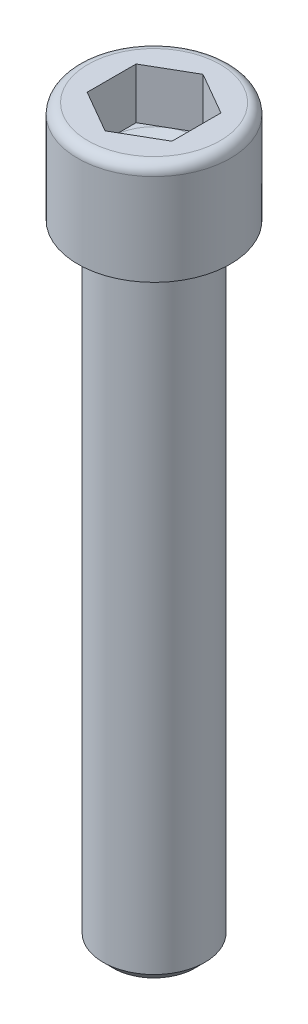
ISO-10303-21;
HEADER;
FILE_DESCRIPTION(('STEP AP214'),'2;1');
FILE_NAME('part.step','',(''),(''),'','','');
FILE_SCHEMA(('AUTOMOTIVE_DESIGN { 1 0 10303 214 1 1 1 1 }'));
ENDSEC;
DATA;
#1=APPLICATION_CONTEXT('core data for automotive mechanical design processes');
#2=APPLICATION_PROTOCOL_DEFINITION('international standard','automotive_design',2000,#1);
#3=PRODUCT_CONTEXT('',#1,'mechanical');
#4=PRODUCT('Part','Part','',(#3));
#5=PRODUCT_RELATED_PRODUCT_CATEGORY('part','',(#4));
#6=PRODUCT_DEFINITION_FORMATION('','',#4);
#7=PRODUCT_DEFINITION_CONTEXT('part definition',#1,'design');
#8=PRODUCT_DEFINITION('design','',#6,#7);
#9=PRODUCT_DEFINITION_SHAPE('','',#8);
#10=(LENGTH_UNIT() NAMED_UNIT(*) SI_UNIT(.MILLI.,.METRE.));
#11=(NAMED_UNIT(*) PLANE_ANGLE_UNIT() SI_UNIT($,.RADIAN.));
#12=(NAMED_UNIT(*) SI_UNIT($,.STERADIAN.) SOLID_ANGLE_UNIT());
#13=UNCERTAINTY_MEASURE_WITH_UNIT(LENGTH_MEASURE(1.E-05),#10,'distance_accuracy_value','');
#14=(GEOMETRIC_REPRESENTATION_CONTEXT(3) GLOBAL_UNCERTAINTY_ASSIGNED_CONTEXT((#13)) GLOBAL_UNIT_ASSIGNED_CONTEXT((#10,
#11,#12)) REPRESENTATION_CONTEXT('',''));
#15=CARTESIAN_POINT('',(0.,0.,0.));
#16=DIRECTION('',(0.,0.,1.));
#17=DIRECTION('',(1.,0.,0.));
#18=AXIS2_PLACEMENT_3D('',#15,#16,#17);
#19=CARTESIAN_POINT('',(0.,85.,5.));
#20=DIRECTION('',(0.,-1.,0.));
#21=DIRECTION('',(0.,0.,-1.));
#22=AXIS2_PLACEMENT_3D('',#19,#20,#21);
#23=PLANE('',#22);
#24=CARTESIAN_POINT('',(0.,85.,0.));
#25=DIRECTION('',(0.,-1.,0.));
#26=DIRECTION('',(0.,0.,-1.));
#27=AXIS2_PLACEMENT_3D('',#24,#25,#26);
#28=CIRCLE('',#27,7.8);
#29=CARTESIAN_POINT('',(0.,85.,-7.8));
#30=VERTEX_POINT('',#29);
#31=EDGE_CURVE('E200',#30,#30,#28,.T.);
#32=ORIENTED_EDGE('',*,*,#31,.F.);
#33=EDGE_LOOP('',(#32));
#34=FACE_BOUND('',#33,.T.);
#35=DIRECTION('',(0.866025403784439,0.,-0.5));
#36=VECTOR('',#35,1.);
#37=CARTESIAN_POINT('',(-4.6650635094611,85.,-3.08012701892219));
#38=LINE('',#37,#36);
#39=CARTESIAN_POINT('',(-5.,85.,-2.88675134594813));
#40=VERTEX_POINT('',#39);
#41=CARTESIAN_POINT('',(0.,85.,-5.77350269189626));
#42=VERTEX_POINT('',#41);
#43=EDGE_CURVE('E70',#40,#42,#38,.T.);
#44=ORIENTED_EDGE('',*,*,#43,.T.);
#45=DIRECTION('',(0.866025403784439,0.,0.5));
#46=VECTOR('',#45,1.);
#47=CARTESIAN_POINT('',(4.6650635094611,85.,-3.08012701892219));
#48=LINE('',#47,#46);
#49=CARTESIAN_POINT('',(5.,85.,-2.88675134594813));
#50=VERTEX_POINT('',#49);
#51=EDGE_CURVE('E12',#42,#50,#48,.T.);
#52=ORIENTED_EDGE('',*,*,#51,.T.);
#53=DIRECTION('',(0.,0.,1.));
#54=VECTOR('',#53,1.);
#55=CARTESIAN_POINT('',(5.,85.,5.));
#56=LINE('',#55,#54);
#57=CARTESIAN_POINT('',(5.,85.,2.88675134594813));
#58=VERTEX_POINT('',#57);
#59=EDGE_CURVE('E55',#50,#58,#56,.T.);
#60=ORIENTED_EDGE('',*,*,#59,.T.);
#61=DIRECTION('',(-0.866025403784439,0.,0.5));
#62=VECTOR('',#61,1.);
#63=CARTESIAN_POINT('',(0.334936490538903,85.,5.58012701892219));
#64=LINE('',#63,#62);
#65=CARTESIAN_POINT('',(0.,85.,5.77350269189626));
#66=VERTEX_POINT('',#65);
#67=EDGE_CURVE('E216',#58,#66,#64,.T.);
#68=ORIENTED_EDGE('',*,*,#67,.T.);
#69=DIRECTION('',(-0.866025403784439,0.,-0.5));
#70=VECTOR('',#69,1.);
#71=CARTESIAN_POINT('',(-0.334936490538903,85.,5.58012701892219));
#72=LINE('',#71,#70);
#73=CARTESIAN_POINT('',(-5.,85.,2.88675134594813));
#74=VERTEX_POINT('',#73);
#75=EDGE_CURVE('E213',#66,#74,#72,.T.);
#76=ORIENTED_EDGE('',*,*,#75,.T.);
#77=DIRECTION('',(0.,0.,-1.));
#78=VECTOR('',#77,1.);
#79=CARTESIAN_POINT('',(-5.,85.,5.));
#80=LINE('',#79,#78);
#81=EDGE_CURVE('E210',#74,#40,#80,.T.);
#82=ORIENTED_EDGE('',*,*,#81,.T.);
#83=EDGE_LOOP('',(#44,#52,#60,#68,#76,#82));
#84=FACE_BOUND('',#83,.T.);
#85=ADVANCED_FACE('F45',(#34,#84),#23,.F.);
#86=CARTESIAN_POINT('',(0.,83.8,0.));
#87=DIRECTION('',(0.,-1.,0.));
#88=DIRECTION('',(0.,0.,-1.));
#89=AXIS2_PLACEMENT_3D('',#86,#87,#88);
#90=TOROIDAL_SURFACE('',#89,7.8,1.2);
#91=CARTESIAN_POINT('',(0.,83.8,0.));
#92=DIRECTION('',(0.,-1.,0.));
#93=DIRECTION('',(0.,0.,-1.));
#94=AXIS2_PLACEMENT_3D('',#91,#92,#93);
#95=CIRCLE('',#94,9.);
#96=CARTESIAN_POINT('',(0.,83.8,-9.));
#97=VERTEX_POINT('',#96);
#98=EDGE_CURVE('E196',#97,#97,#95,.T.);
#99=ORIENTED_EDGE('',*,*,#98,.F.);
#100=EDGE_LOOP('',(#99));
#101=FACE_BOUND('',#100,.T.);
#102=ORIENTED_EDGE('',*,*,#31,.T.);
#103=EDGE_LOOP('',(#102));
#104=FACE_BOUND('',#103,.T.);
#105=ADVANCED_FACE('F246',(#101,#104),#90,.T.);
#106=CARTESIAN_POINT('',(0.,0.,0.));
#107=DIRECTION('',(0.,-1.,0.));
#108=DIRECTION('',(0.,0.,-1.));
#109=AXIS2_PLACEMENT_3D('',#106,#107,#108);
#110=CYLINDRICAL_SURFACE('',#109,9.);
#111=CARTESIAN_POINT('',(0.,73.,0.));
#112=DIRECTION('',(0.,-1.,0.));
#113=DIRECTION('',(0.,0.,-1.));
#114=AXIS2_PLACEMENT_3D('',#111,#112,#113);
#115=CIRCLE('',#114,9.);
#116=CARTESIAN_POINT('',(0.,73.,-9.));
#117=VERTEX_POINT('',#116);
#118=EDGE_CURVE('E192',#117,#117,#115,.T.);
#119=ORIENTED_EDGE('',*,*,#118,.F.);
#120=EDGE_LOOP('',(#119));
#121=FACE_BOUND('',#120,.T.);
#122=ORIENTED_EDGE('',*,*,#98,.T.);
#123=EDGE_LOOP('',(#122));
#124=FACE_BOUND('',#123,.T.);
#125=ADVANCED_FACE('F240',(#121,#124),#110,.T.);
#126=CARTESIAN_POINT('',(0.,73.,9.));
#127=DIRECTION('',(0.,1.,0.));
#128=DIRECTION('',(0.,0.,1.));
#129=AXIS2_PLACEMENT_3D('',#126,#127,#128);
#130=PLANE('',#129);
#131=CARTESIAN_POINT('',(0.,73.,0.));
#132=DIRECTION('',(0.,-1.,0.));
#133=DIRECTION('',(0.,0.,-1.));
#134=AXIS2_PLACEMENT_3D('',#131,#132,#133);
#135=CIRCLE('',#134,6.);
#136=CARTESIAN_POINT('',(0.,73.,-6.));
#137=VERTEX_POINT('',#136);
#138=EDGE_CURVE('E188',#137,#137,#135,.T.);
#139=ORIENTED_EDGE('',*,*,#138,.F.);
#140=EDGE_LOOP('',(#139));
#141=FACE_BOUND('',#140,.T.);
#142=ORIENTED_EDGE('',*,*,#118,.T.);
#143=EDGE_LOOP('',(#142));
#144=FACE_BOUND('',#143,.T.);
#145=ADVANCED_FACE('F234',(#141,#144),#130,.F.);
#146=CARTESIAN_POINT('',(0.,0.,0.));
#147=DIRECTION('',(0.,-1.,0.));
#148=DIRECTION('',(0.,0.,-1.));
#149=AXIS2_PLACEMENT_3D('',#146,#147,#148);
#150=CYLINDRICAL_SURFACE('',#149,6.);
#151=CARTESIAN_POINT('',(0.,0.2,0.));
#152=DIRECTION('',(0.,-1.,0.));
#153=DIRECTION('',(0.,0.,-1.));
#154=AXIS2_PLACEMENT_3D('',#151,#152,#153);
#155=CIRCLE('',#154,6.);
#156=CARTESIAN_POINT('',(0.,0.2,-6.));
#157=VERTEX_POINT('',#156);
#158=EDGE_CURVE('E49',#157,#157,#155,.T.);
#159=ORIENTED_EDGE('',*,*,#158,.F.);
#160=EDGE_LOOP('',(#159));
#161=FACE_BOUND('',#160,.T.);
#162=ORIENTED_EDGE('',*,*,#138,.T.);
#163=EDGE_LOOP('',(#162));
#164=FACE_BOUND('',#163,.T.);
#165=ADVANCED_FACE('F231',(#161,#164),#150,.T.);
#166=CARTESIAN_POINT('',(0.,0.2,0.));
#167=DIRECTION('',(0.,1.,0.));
#168=DIRECTION('',(0.,0.,1.));
#169=AXIS2_PLACEMENT_3D('',#166,#167,#168);
#170=CONICAL_SURFACE('',#169,6.,0.785398163397448);
#171=CARTESIAN_POINT('',(0.,-1.,0.));
#172=DIRECTION('',(0.,-1.,0.));
#173=DIRECTION('',(0.,0.,-1.));
#174=AXIS2_PLACEMENT_3D('',#171,#172,#173);
#175=CIRCLE('',#174,4.8);
#176=CARTESIAN_POINT('',(0.,-1.,-4.8));
#177=VERTEX_POINT('',#176);
#178=EDGE_CURVE('E172',#177,#177,#175,.T.);
#179=ORIENTED_EDGE('',*,*,#178,.F.);
#180=EDGE_LOOP('',(#179));
#181=FACE_BOUND('',#180,.T.);
#182=ORIENTED_EDGE('',*,*,#158,.T.);
#183=EDGE_LOOP('',(#182));
#184=FACE_BOUND('',#183,.T.);
#185=ADVANCED_FACE('F47',(#181,#184),#170,.T.);
#186=CARTESIAN_POINT('',(0.,-1.,4.8));
#187=DIRECTION('',(0.,1.,0.));
#188=DIRECTION('',(0.,0.,1.));
#189=AXIS2_PLACEMENT_3D('',#186,#187,#188);
#190=PLANE('',#189);
#191=ORIENTED_EDGE('',*,*,#178,.T.);
#192=EDGE_LOOP('',(#191));
#193=FACE_BOUND('',#192,.T.);
#194=ADVANCED_FACE('F263',(#193),#190,.F.);
#195=CARTESIAN_POINT('',(0.,79.,0.));
#196=DIRECTION('',(0.,1.,0.));
#197=DIRECTION('',(0.,0.,1.));
#198=AXIS2_PLACEMENT_3D('',#195,#196,#197);
#199=PLANE('',#198);
#200=CARTESIAN_POINT('',(0.,79.,0.));
#201=DIRECTION('',(0.,-1.,0.));
#202=DIRECTION('',(0.,0.,-1.));
#203=AXIS2_PLACEMENT_3D('',#200,#201,#202);
#204=CIRCLE('',#203,5.);
#205=CARTESIAN_POINT('',(-2.5,79.,4.3301270189222));
#206=VERTEX_POINT('',#205);
#207=CARTESIAN_POINT('',(-5.,79.,0.));
#208=VERTEX_POINT('',#207);
#209=EDGE_CURVE('E455',#206,#208,#204,.T.);
#210=ORIENTED_EDGE('',*,*,#209,.T.);
#211=DIRECTION('',(0.,0.,1.));
#212=VECTOR('',#211,1.);
#213=CARTESIAN_POINT('',(-5.,79.,-2.88675134594813));
#214=LINE('',#213,#212);
#215=CARTESIAN_POINT('',(-5.,79.,2.88675134594813));
#216=VERTEX_POINT('',#215);
#217=EDGE_CURVE('E148',#208,#216,#214,.T.);
#218=ORIENTED_EDGE('',*,*,#217,.T.);
#219=DIRECTION('',(0.866025403784439,0.,0.5));
#220=VECTOR('',#219,1.);
#221=CARTESIAN_POINT('',(-5.,79.,2.88675134594813));
#222=LINE('',#221,#220);
#223=EDGE_CURVE('E159',#216,#206,#222,.T.);
#224=ORIENTED_EDGE('',*,*,#223,.T.);
#225=EDGE_LOOP('',(#210,#218,#224));
#226=FACE_BOUND('',#225,.T.);
#227=ADVANCED_FACE('F265',(#226),#199,.T.);
#228=CARTESIAN_POINT('',(-2.5,79.,-4.33012701892219));
#229=VERTEX_POINT('',#228);
#230=EDGE_CURVE('E450',#208,#229,#204,.T.);
#231=ORIENTED_EDGE('',*,*,#230,.T.);
#232=DIRECTION('',(-0.866025403784439,0.,0.5));
#233=VECTOR('',#232,1.);
#234=CARTESIAN_POINT('',(0.,79.,-5.77350269189626));
#235=LINE('',#234,#233);
#236=CARTESIAN_POINT('',(-5.,79.,-2.88675134594813));
#237=VERTEX_POINT('',#236);
#238=EDGE_CURVE('E146',#229,#237,#235,.T.);
#239=ORIENTED_EDGE('',*,*,#238,.T.);
#240=EDGE_CURVE('E152',#237,#208,#214,.T.);
#241=ORIENTED_EDGE('',*,*,#240,.T.);
#242=EDGE_LOOP('',(#231,#239,#241));
#243=FACE_BOUND('',#242,.T.);
#244=ADVANCED_FACE('F270',(#243),#199,.T.);
#245=CARTESIAN_POINT('',(2.5,79.,-4.3301270189222));
#246=VERTEX_POINT('',#245);
#247=EDGE_CURVE('E127',#229,#246,#204,.T.);
#248=ORIENTED_EDGE('',*,*,#247,.T.);
#249=DIRECTION('',(-0.866025403784439,0.,-0.5));
#250=VECTOR('',#249,1.);
#251=CARTESIAN_POINT('',(5.,79.,-2.88675134594813));
#252=LINE('',#251,#250);
#253=CARTESIAN_POINT('',(0.,79.,-5.77350269189626));
#254=VERTEX_POINT('',#253);
#255=EDGE_CURVE('E121',#246,#254,#252,.T.);
#256=ORIENTED_EDGE('',*,*,#255,.T.);
#257=EDGE_CURVE('E125',#254,#229,#235,.T.);
#258=ORIENTED_EDGE('',*,*,#257,.T.);
#259=EDGE_LOOP('',(#248,#256,#258));
#260=FACE_BOUND('',#259,.T.);
#261=ADVANCED_FACE('F123',(#260),#199,.T.);
#262=CARTESIAN_POINT('',(5.,79.,0.));
#263=VERTEX_POINT('',#262);
#264=EDGE_CURVE('E204',#246,#263,#204,.T.);
#265=ORIENTED_EDGE('',*,*,#264,.T.);
#266=DIRECTION('',(0.,0.,-1.));
#267=VECTOR('',#266,1.);
#268=CARTESIAN_POINT('',(5.,79.,2.88675134594813));
#269=LINE('',#268,#267);
#270=CARTESIAN_POINT('',(5.,79.,-2.88675134594813));
#271=VERTEX_POINT('',#270);
#272=EDGE_CURVE('E165',#263,#271,#269,.T.);
#273=ORIENTED_EDGE('',*,*,#272,.T.);
#274=EDGE_CURVE('E132',#271,#246,#252,.T.);
#275=ORIENTED_EDGE('',*,*,#274,.T.);
#276=EDGE_LOOP('',(#265,#273,#275));
#277=FACE_BOUND('',#276,.T.);
#278=ADVANCED_FACE('F321',(#277),#199,.T.);
#279=CARTESIAN_POINT('',(2.5,79.,4.33012701892219));
#280=VERTEX_POINT('',#279);
#281=EDGE_CURVE('E207',#263,#280,#204,.T.);
#282=ORIENTED_EDGE('',*,*,#281,.T.);
#283=DIRECTION('',(0.866025403784439,0.,-0.5));
#284=VECTOR('',#283,1.);
#285=CARTESIAN_POINT('',(0.,79.,5.77350269189626));
#286=LINE('',#285,#284);
#287=CARTESIAN_POINT('',(5.,79.,2.88675134594813));
#288=VERTEX_POINT('',#287);
#289=EDGE_CURVE('E162',#280,#288,#286,.T.);
#290=ORIENTED_EDGE('',*,*,#289,.T.);
#291=EDGE_CURVE('E141',#288,#263,#269,.T.);
#292=ORIENTED_EDGE('',*,*,#291,.T.);
#293=EDGE_LOOP('',(#282,#290,#292));
#294=FACE_BOUND('',#293,.T.);
#295=ADVANCED_FACE('F329',(#294),#199,.T.);
#296=EDGE_CURVE('E457',#280,#206,#204,.T.);
#297=ORIENTED_EDGE('',*,*,#296,.T.);
#298=CARTESIAN_POINT('',(0.,79.,5.77350269189626));
#299=VERTEX_POINT('',#298);
#300=EDGE_CURVE('E158',#206,#299,#222,.T.);
#301=ORIENTED_EDGE('',*,*,#300,.T.);
#302=EDGE_CURVE('E63',#299,#280,#286,.T.);
#303=ORIENTED_EDGE('',*,*,#302,.T.);
#304=EDGE_LOOP('',(#297,#301,#303));
#305=FACE_BOUND('',#304,.T.);
#306=ADVANCED_FACE('F273',(#305),#199,.T.);
#307=CARTESIAN_POINT('',(5.,79.,-2.88675134594813));
#308=DIRECTION('',(0.5,0.,-0.866025403784439));
#309=DIRECTION('',(-0.866025403784439,0.,-0.5));
#310=AXIS2_PLACEMENT_3D('',#307,#308,#309);
#311=PLANE('',#310);
#312=ORIENTED_EDGE('',*,*,#274,.F.);
#313=DIRECTION('',(0.,1.,0.));
#314=VECTOR('',#313,1.);
#315=CARTESIAN_POINT('',(5.,79.,-2.88675134594813));
#316=LINE('',#315,#314);
#317=EDGE_CURVE('E169',#271,#50,#316,.T.);
#318=ORIENTED_EDGE('',*,*,#317,.T.);
#319=ORIENTED_EDGE('',*,*,#51,.F.);
#320=DIRECTION('',(0.,1.,0.));
#321=VECTOR('',#320,1.);
#322=CARTESIAN_POINT('',(0.,79.,-5.77350269189626));
#323=LINE('',#322,#321);
#324=EDGE_CURVE('E135',#254,#42,#323,.T.);
#325=ORIENTED_EDGE('',*,*,#324,.F.);
#326=ORIENTED_EDGE('',*,*,#255,.F.);
#327=EDGE_LOOP('',(#312,#318,#319,#325,#326));
#328=FACE_BOUND('',#327,.T.);
#329=ADVANCED_FACE('F136',(#328),#311,.F.);
#330=CARTESIAN_POINT('',(5.,79.,2.88675134594813));
#331=DIRECTION('',(1.,0.,0.));
#332=DIRECTION('',(0.,0.,-1.));
#333=AXIS2_PLACEMENT_3D('',#330,#331,#332);
#334=PLANE('',#333);
#335=ORIENTED_EDGE('',*,*,#291,.F.);
#336=DIRECTION('',(0.,1.,0.));
#337=VECTOR('',#336,1.);
#338=CARTESIAN_POINT('',(5.,79.,2.88675134594813));
#339=LINE('',#338,#337);
#340=EDGE_CURVE('E173',#288,#58,#339,.T.);
#341=ORIENTED_EDGE('',*,*,#340,.T.);
#342=ORIENTED_EDGE('',*,*,#59,.F.);
#343=ORIENTED_EDGE('',*,*,#317,.F.);
#344=ORIENTED_EDGE('',*,*,#272,.F.);
#345=EDGE_LOOP('',(#335,#341,#342,#343,#344));
#346=FACE_BOUND('',#345,.T.);
#347=ADVANCED_FACE('F353',(#346),#334,.F.);
#348=CARTESIAN_POINT('',(0.,79.,5.77350269189626));
#349=DIRECTION('',(0.5,0.,0.866025403784438));
#350=DIRECTION('',(0.866025403784439,0.,-0.5));
#351=AXIS2_PLACEMENT_3D('',#348,#349,#350);
#352=PLANE('',#351);
#353=ORIENTED_EDGE('',*,*,#302,.F.);
#354=DIRECTION('',(0.,1.,0.));
#355=VECTOR('',#354,1.);
#356=CARTESIAN_POINT('',(0.,79.,5.77350269189626));
#357=LINE('',#356,#355);
#358=EDGE_CURVE('E177',#299,#66,#357,.T.);
#359=ORIENTED_EDGE('',*,*,#358,.T.);
#360=ORIENTED_EDGE('',*,*,#67,.F.);
#361=ORIENTED_EDGE('',*,*,#340,.F.);
#362=ORIENTED_EDGE('',*,*,#289,.F.);
#363=EDGE_LOOP('',(#353,#359,#360,#361,#362));
#364=FACE_BOUND('',#363,.T.);
#365=ADVANCED_FACE('F362',(#364),#352,.F.);
#366=CARTESIAN_POINT('',(-5.,79.,2.88675134594813));
#367=DIRECTION('',(-0.5,0.,0.866025403784439));
#368=DIRECTION('',(0.866025403784439,0.,0.5));
#369=AXIS2_PLACEMENT_3D('',#366,#367,#368);
#370=PLANE('',#369);
#371=ORIENTED_EDGE('',*,*,#223,.F.);
#372=DIRECTION('',(0.,1.,0.));
#373=VECTOR('',#372,1.);
#374=CARTESIAN_POINT('',(-5.,79.,2.88675134594813));
#375=LINE('',#374,#373);
#376=EDGE_CURVE('E181',#216,#74,#375,.T.);
#377=ORIENTED_EDGE('',*,*,#376,.T.);
#378=ORIENTED_EDGE('',*,*,#75,.F.);
#379=ORIENTED_EDGE('',*,*,#358,.F.);
#380=ORIENTED_EDGE('',*,*,#300,.F.);
#381=EDGE_LOOP('',(#371,#377,#378,#379,#380));
#382=FACE_BOUND('',#381,.T.);
#383=ADVANCED_FACE('F372',(#382),#370,.F.);
#384=CARTESIAN_POINT('',(-5.,79.,-2.88675134594813));
#385=DIRECTION('',(-1.,0.,0.));
#386=DIRECTION('',(0.,0.,1.));
#387=AXIS2_PLACEMENT_3D('',#384,#385,#386);
#388=PLANE('',#387);
#389=ORIENTED_EDGE('',*,*,#240,.F.);
#390=DIRECTION('',(0.,1.,0.));
#391=VECTOR('',#390,1.);
#392=CARTESIAN_POINT('',(-5.,79.,-2.88675134594813));
#393=LINE('',#392,#391);
#394=EDGE_CURVE('E140',#237,#40,#393,.T.);
#395=ORIENTED_EDGE('',*,*,#394,.T.);
#396=ORIENTED_EDGE('',*,*,#81,.F.);
#397=ORIENTED_EDGE('',*,*,#376,.F.);
#398=ORIENTED_EDGE('',*,*,#217,.F.);
#399=EDGE_LOOP('',(#389,#395,#396,#397,#398));
#400=FACE_BOUND('',#399,.T.);
#401=ADVANCED_FACE('F382',(#400),#388,.F.);
#402=CARTESIAN_POINT('',(0.,79.,-5.77350269189626));
#403=DIRECTION('',(-0.5,0.,-0.866025403784439));
#404=DIRECTION('',(-0.866025403784439,0.,0.5));
#405=AXIS2_PLACEMENT_3D('',#402,#403,#404);
#406=PLANE('',#405);
#407=ORIENTED_EDGE('',*,*,#257,.F.);
#408=ORIENTED_EDGE('',*,*,#324,.T.);
#409=ORIENTED_EDGE('',*,*,#43,.F.);
#410=ORIENTED_EDGE('',*,*,#394,.F.);
#411=ORIENTED_EDGE('',*,*,#238,.F.);
#412=EDGE_LOOP('',(#407,#408,#409,#410,#411));
#413=FACE_BOUND('',#412,.T.);
#414=ADVANCED_FACE('F144',(#413),#406,.F.);
#415=CARTESIAN_POINT('',(0.,78.1183650964577,0.));
#416=DIRECTION('',(0.,1.,0.));
#417=DIRECTION('',(0.,0.,1.));
#418=AXIS2_PLACEMENT_3D('',#415,#416,#417);
#419=CONICAL_SURFACE('',#418,0.,1.39626340159547);
#420=ORIENTED_EDGE('',*,*,#264,.F.);
#421=ORIENTED_EDGE('',*,*,#247,.F.);
#422=ORIENTED_EDGE('',*,*,#230,.F.);
#423=ORIENTED_EDGE('',*,*,#209,.F.);
#424=ORIENTED_EDGE('',*,*,#296,.F.);
#425=ORIENTED_EDGE('',*,*,#281,.F.);
#426=EDGE_LOOP('',(#420,#421,#422,#423,#424,#425));
#427=FACE_BOUND('',#426,.T.);
#428=CARTESIAN_POINT('',(0.,78.1183650964577,0.));
#429=VERTEX_POINT('',#428);
#430=VERTEX_LOOP('',#429);
#431=FACE_BOUND('',#430,.T.);
#432=ADVANCED_FACE('F260',(#427,#431),#419,.F.);
#433=CLOSED_SHELL('',(#85,#105,#125,#145,#165,#185,#194,#227,#244,#261,#278,#295,#306,#329,#347,
#365,#383,#401,#414,#432));
#434=MANIFOLD_SOLID_BREP('B2',#433);
#435=ADVANCED_BREP_SHAPE_REPRESENTATION('',(#18,#434),#14);
#436=SHAPE_DEFINITION_REPRESENTATION(#9,#435);
ENDSEC;
END-ISO-10303-21;
